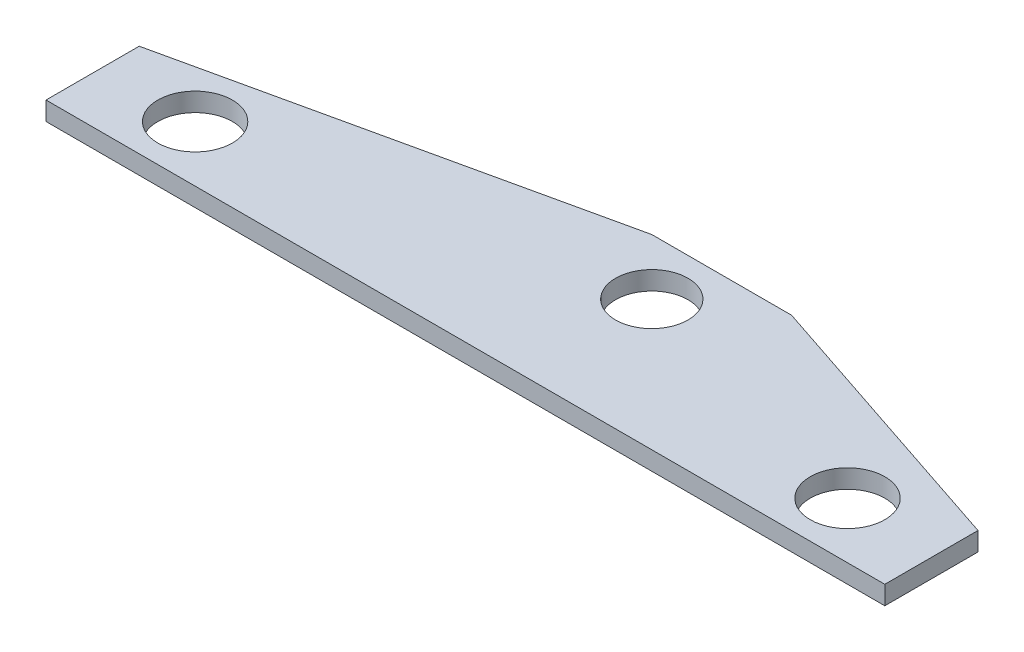
ISO-10303-21;
HEADER;
FILE_DESCRIPTION(('STEP AP214'),'2;1');
FILE_NAME('part.step','',(''),(''),'','','');
FILE_SCHEMA(('AUTOMOTIVE_DESIGN { 1 0 10303 214 1 1 1 1 }'));
ENDSEC;
DATA;
#1=APPLICATION_CONTEXT('core data for automotive mechanical design processes');
#2=APPLICATION_PROTOCOL_DEFINITION('international standard','automotive_design',2000,#1);
#3=PRODUCT_CONTEXT('',#1,'mechanical');
#4=PRODUCT('Part','Part','',(#3));
#5=PRODUCT_RELATED_PRODUCT_CATEGORY('part','',(#4));
#6=PRODUCT_DEFINITION_FORMATION('','',#4);
#7=PRODUCT_DEFINITION_CONTEXT('part definition',#1,'design');
#8=PRODUCT_DEFINITION('design','',#6,#7);
#9=PRODUCT_DEFINITION_SHAPE('','',#8);
#10=(LENGTH_UNIT() NAMED_UNIT(*) SI_UNIT(.MILLI.,.METRE.));
#11=(NAMED_UNIT(*) PLANE_ANGLE_UNIT() SI_UNIT($,.RADIAN.));
#12=(NAMED_UNIT(*) SI_UNIT($,.STERADIAN.) SOLID_ANGLE_UNIT());
#13=UNCERTAINTY_MEASURE_WITH_UNIT(LENGTH_MEASURE(1.E-05),#10,'distance_accuracy_value','');
#14=(GEOMETRIC_REPRESENTATION_CONTEXT(3) GLOBAL_UNCERTAINTY_ASSIGNED_CONTEXT((#13)) GLOBAL_UNIT_ASSIGNED_CONTEXT((#10,
#11,#12)) REPRESENTATION_CONTEXT('',''));
#15=CARTESIAN_POINT('',(0.,0.,0.));
#16=DIRECTION('',(0.,0.,1.));
#17=DIRECTION('',(1.,0.,0.));
#18=AXIS2_PLACEMENT_3D('',#15,#16,#17);
#19=CARTESIAN_POINT('',(0.,2.,0.));
#20=DIRECTION('',(0.,-1.,0.));
#21=DIRECTION('',(0.,0.,-1.));
#22=AXIS2_PLACEMENT_3D('',#19,#20,#21);
#23=PLANE('',#22);
#24=CARTESIAN_POINT('',(51.,2.,-14.));
#25=DIRECTION('',(0.,1.,0.));
#26=DIRECTION('',(0.,0.,1.));
#27=AXIS2_PLACEMENT_3D('',#24,#25,#26);
#28=CIRCLE('',#27,3.88317438694511);
#29=CARTESIAN_POINT('',(51.,2.,-10.1168256130549));
#30=VERTEX_POINT('',#29);
#31=EDGE_CURVE('E176',#30,#30,#28,.T.);
#32=ORIENTED_EDGE('',*,*,#31,.F.);
#33=EDGE_LOOP('',(#32));
#34=FACE_BOUND('',#33,.T.);
#35=CARTESIAN_POINT('',(10.,2.,-6.));
#36=DIRECTION('',(0.,1.,0.));
#37=DIRECTION('',(0.,0.,1.));
#38=AXIS2_PLACEMENT_3D('',#35,#36,#37);
#39=CIRCLE('',#38,4.);
#40=CARTESIAN_POINT('',(10.,2.,-2.));
#41=VERTEX_POINT('',#40);
#42=EDGE_CURVE('E134',#41,#41,#39,.T.);
#43=ORIENTED_EDGE('',*,*,#42,.F.);
#44=EDGE_LOOP('',(#43));
#45=FACE_BOUND('',#44,.T.);
#46=DIRECTION('',(-1.,0.,0.));
#47=VECTOR('',#46,1.);
#48=CARTESIAN_POINT('',(0.,2.,-20.));
#49=LINE('',#48,#47);
#50=CARTESIAN_POINT('',(60.,2.,-20.));
#51=VERTEX_POINT('',#50);
#52=CARTESIAN_POINT('',(45.,2.,-20.));
#53=VERTEX_POINT('',#52);
#54=EDGE_CURVE('E137',#51,#53,#49,.T.);
#55=ORIENTED_EDGE('',*,*,#54,.T.);
#56=DIRECTION('',(0.976187060183953,0.,-0.216930457818656));
#57=VECTOR('',#56,1.);
#58=CARTESIAN_POINT('',(-2.11764705882353,2.,-9.52941176470588));
#59=LINE('',#58,#57);
#60=CARTESIAN_POINT('',(0.,2.,-10.));
#61=VERTEX_POINT('',#60);
#62=EDGE_CURVE('E112',#61,#53,#59,.T.);
#63=ORIENTED_EDGE('',*,*,#62,.F.);
#64=DIRECTION('',(0.,0.,1.));
#65=VECTOR('',#64,1.);
#66=CARTESIAN_POINT('',(0.,2.,0.));
#67=LINE('',#66,#65);
#68=CARTESIAN_POINT('',(0.,2.,0.));
#69=VERTEX_POINT('',#68);
#70=EDGE_CURVE('E119',#61,#69,#67,.T.);
#71=ORIENTED_EDGE('',*,*,#70,.T.);
#72=DIRECTION('',(1.,0.,0.));
#73=VECTOR('',#72,1.);
#74=CARTESIAN_POINT('',(0.,2.,0.));
#75=LINE('',#74,#73);
#76=CARTESIAN_POINT('',(90.,2.,0.));
#77=VERTEX_POINT('',#76);
#78=EDGE_CURVE('E158',#69,#77,#75,.T.);
#79=ORIENTED_EDGE('',*,*,#78,.T.);
#80=DIRECTION('',(0.,0.,-1.));
#81=VECTOR('',#80,1.);
#82=CARTESIAN_POINT('',(90.,2.,0.));
#83=LINE('',#82,#81);
#84=CARTESIAN_POINT('',(90.,2.,-10.));
#85=VERTEX_POINT('',#84);
#86=EDGE_CURVE('E152',#77,#85,#83,.T.);
#87=ORIENTED_EDGE('',*,*,#86,.T.);
#88=DIRECTION('',(0.948683298050514,0.,0.316227766016838));
#89=VECTOR('',#88,1.);
#90=CARTESIAN_POINT('',(12.,2.,-36.));
#91=LINE('',#90,#89);
#92=EDGE_CURVE('E189',#51,#85,#91,.T.);
#93=ORIENTED_EDGE('',*,*,#92,.F.);
#94=EDGE_LOOP('',(#55,#63,#71,#79,#87,#93));
#95=FACE_BOUND('',#94,.T.);
#96=CARTESIAN_POINT('',(80.,2.,-6.00000000000001));
#97=DIRECTION('',(0.,1.,0.));
#98=DIRECTION('',(0.,0.,1.));
#99=AXIS2_PLACEMENT_3D('',#96,#97,#98);
#100=CIRCLE('',#99,4.00000000000001);
#101=CARTESIAN_POINT('',(80.,2.,-2.));
#102=VERTEX_POINT('',#101);
#103=EDGE_CURVE('E168',#102,#102,#100,.F.);
#104=ORIENTED_EDGE('',*,*,#103,.T.);
#105=EDGE_LOOP('',(#104));
#106=FACE_BOUND('',#105,.T.);
#107=ADVANCED_FACE('F51',(#34,#45,#95,#106),#23,.F.);
#108=CARTESIAN_POINT('',(0.,0.,0.));
#109=DIRECTION('',(0.,-1.,0.));
#110=DIRECTION('',(0.,0.,-1.));
#111=AXIS2_PLACEMENT_3D('',#108,#109,#110);
#112=PLANE('',#111);
#113=CARTESIAN_POINT('',(51.,0.,-14.));
#114=DIRECTION('',(0.,1.,0.));
#115=DIRECTION('',(0.,0.,1.));
#116=AXIS2_PLACEMENT_3D('',#113,#114,#115);
#117=CIRCLE('',#116,3.88317438694511);
#118=CARTESIAN_POINT('',(51.,0.,-10.1168256130549));
#119=VERTEX_POINT('',#118);
#120=EDGE_CURVE('E166',#119,#119,#117,.T.);
#121=ORIENTED_EDGE('',*,*,#120,.T.);
#122=EDGE_LOOP('',(#121));
#123=FACE_BOUND('',#122,.T.);
#124=CARTESIAN_POINT('',(10.,0.,-6.));
#125=DIRECTION('',(0.,1.,0.));
#126=DIRECTION('',(0.,0.,1.));
#127=AXIS2_PLACEMENT_3D('',#124,#125,#126);
#128=CIRCLE('',#127,4.);
#129=CARTESIAN_POINT('',(10.,0.,-2.));
#130=VERTEX_POINT('',#129);
#131=EDGE_CURVE('E127',#130,#130,#128,.T.);
#132=ORIENTED_EDGE('',*,*,#131,.T.);
#133=EDGE_LOOP('',(#132));
#134=FACE_BOUND('',#133,.T.);
#135=DIRECTION('',(0.976187060183953,0.,-0.216930457818656));
#136=VECTOR('',#135,1.);
#137=CARTESIAN_POINT('',(-2.11764705882353,0.,-9.52941176470588));
#138=LINE('',#137,#136);
#139=CARTESIAN_POINT('',(0.,0.,-10.));
#140=VERTEX_POINT('',#139);
#141=CARTESIAN_POINT('',(45.,0.,-20.));
#142=VERTEX_POINT('',#141);
#143=EDGE_CURVE('E102',#140,#142,#138,.T.);
#144=ORIENTED_EDGE('',*,*,#143,.T.);
#145=DIRECTION('',(-1.,0.,0.));
#146=VECTOR('',#145,1.);
#147=CARTESIAN_POINT('',(0.,0.,-20.));
#148=LINE('',#147,#146);
#149=CARTESIAN_POINT('',(60.,0.,-20.));
#150=VERTEX_POINT('',#149);
#151=EDGE_CURVE('E143',#150,#142,#148,.T.);
#152=ORIENTED_EDGE('',*,*,#151,.F.);
#153=DIRECTION('',(0.948683298050514,0.,0.316227766016838));
#154=VECTOR('',#153,1.);
#155=CARTESIAN_POINT('',(12.,0.,-36.));
#156=LINE('',#155,#154);
#157=CARTESIAN_POINT('',(90.,0.,-10.));
#158=VERTEX_POINT('',#157);
#159=EDGE_CURVE('E186',#150,#158,#156,.T.);
#160=ORIENTED_EDGE('',*,*,#159,.T.);
#161=DIRECTION('',(0.,0.,-1.));
#162=VECTOR('',#161,1.);
#163=CARTESIAN_POINT('',(90.,0.,0.));
#164=LINE('',#163,#162);
#165=CARTESIAN_POINT('',(90.,0.,0.));
#166=VERTEX_POINT('',#165);
#167=EDGE_CURVE('E131',#166,#158,#164,.T.);
#168=ORIENTED_EDGE('',*,*,#167,.F.);
#169=DIRECTION('',(1.,0.,0.));
#170=VECTOR('',#169,1.);
#171=CARTESIAN_POINT('',(0.,0.,0.));
#172=LINE('',#171,#170);
#173=CARTESIAN_POINT('',(0.,0.,0.));
#174=VERTEX_POINT('',#173);
#175=EDGE_CURVE('E125',#174,#166,#172,.T.);
#176=ORIENTED_EDGE('',*,*,#175,.F.);
#177=DIRECTION('',(0.,0.,1.));
#178=VECTOR('',#177,1.);
#179=CARTESIAN_POINT('',(0.,0.,0.));
#180=LINE('',#179,#178);
#181=EDGE_CURVE('E117',#140,#174,#180,.T.);
#182=ORIENTED_EDGE('',*,*,#181,.F.);
#183=EDGE_LOOP('',(#144,#152,#160,#168,#176,#182));
#184=FACE_BOUND('',#183,.T.);
#185=CARTESIAN_POINT('',(80.,0.,-6.00000000000001));
#186=DIRECTION('',(0.,1.,0.));
#187=DIRECTION('',(0.,0.,1.));
#188=AXIS2_PLACEMENT_3D('',#185,#186,#187);
#189=CIRCLE('',#188,4.00000000000001);
#190=CARTESIAN_POINT('',(80.,0.,-2.));
#191=VERTEX_POINT('',#190);
#192=EDGE_CURVE('E172',#191,#191,#189,.F.);
#193=ORIENTED_EDGE('',*,*,#192,.F.);
#194=EDGE_LOOP('',(#193));
#195=FACE_BOUND('',#194,.T.);
#196=ADVANCED_FACE('F122',(#123,#134,#184,#195),#112,.T.);
#197=CARTESIAN_POINT('',(0.,2.,0.));
#198=DIRECTION('',(1.,0.,0.));
#199=DIRECTION('',(0.,0.,-1.));
#200=AXIS2_PLACEMENT_3D('',#197,#198,#199);
#201=PLANE('',#200);
#202=ORIENTED_EDGE('',*,*,#70,.F.);
#203=DIRECTION('',(0.,1.,0.));
#204=VECTOR('',#203,1.);
#205=CARTESIAN_POINT('',(0.,0.,-10.));
#206=LINE('',#205,#204);
#207=EDGE_CURVE('E105',#140,#61,#206,.T.);
#208=ORIENTED_EDGE('',*,*,#207,.F.);
#209=ORIENTED_EDGE('',*,*,#181,.T.);
#210=DIRECTION('',(0.,-1.,0.));
#211=VECTOR('',#210,1.);
#212=CARTESIAN_POINT('',(0.,2.,0.));
#213=LINE('',#212,#211);
#214=EDGE_CURVE('E12',#69,#174,#213,.T.);
#215=ORIENTED_EDGE('',*,*,#214,.F.);
#216=EDGE_LOOP('',(#202,#208,#209,#215));
#217=FACE_BOUND('',#216,.T.);
#218=ADVANCED_FACE('F53',(#217),#201,.F.);
#219=CARTESIAN_POINT('',(0.,2.,0.));
#220=DIRECTION('',(0.,0.,-1.));
#221=DIRECTION('',(-1.,0.,0.));
#222=AXIS2_PLACEMENT_3D('',#219,#220,#221);
#223=PLANE('',#222);
#224=ORIENTED_EDGE('',*,*,#175,.T.);
#225=DIRECTION('',(0.,-1.,0.));
#226=VECTOR('',#225,1.);
#227=CARTESIAN_POINT('',(90.,2.,0.));
#228=LINE('',#227,#226);
#229=EDGE_CURVE('E60',#77,#166,#228,.T.);
#230=ORIENTED_EDGE('',*,*,#229,.F.);
#231=ORIENTED_EDGE('',*,*,#78,.F.);
#232=ORIENTED_EDGE('',*,*,#214,.T.);
#233=EDGE_LOOP('',(#224,#230,#231,#232));
#234=FACE_BOUND('',#233,.T.);
#235=ADVANCED_FACE('F202',(#234),#223,.F.);
#236=CARTESIAN_POINT('',(90.,2.,0.));
#237=DIRECTION('',(-1.,0.,0.));
#238=DIRECTION('',(0.,0.,1.));
#239=AXIS2_PLACEMENT_3D('',#236,#237,#238);
#240=PLANE('',#239);
#241=ORIENTED_EDGE('',*,*,#167,.T.);
#242=DIRECTION('',(0.,1.,0.));
#243=VECTOR('',#242,1.);
#244=CARTESIAN_POINT('',(90.,0.,-10.));
#245=LINE('',#244,#243);
#246=EDGE_CURVE('E67',#158,#85,#245,.T.);
#247=ORIENTED_EDGE('',*,*,#246,.T.);
#248=ORIENTED_EDGE('',*,*,#86,.F.);
#249=ORIENTED_EDGE('',*,*,#229,.T.);
#250=EDGE_LOOP('',(#241,#247,#248,#249));
#251=FACE_BOUND('',#250,.T.);
#252=ADVANCED_FACE('F200',(#251),#240,.F.);
#253=CARTESIAN_POINT('',(0.,2.,-20.));
#254=DIRECTION('',(0.,0.,1.));
#255=DIRECTION('',(1.,0.,0.));
#256=AXIS2_PLACEMENT_3D('',#253,#254,#255);
#257=PLANE('',#256);
#258=ORIENTED_EDGE('',*,*,#151,.T.);
#259=DIRECTION('',(0.,1.,0.));
#260=VECTOR('',#259,1.);
#261=CARTESIAN_POINT('',(45.,0.,-20.));
#262=LINE('',#261,#260);
#263=EDGE_CURVE('E75',#142,#53,#262,.T.);
#264=ORIENTED_EDGE('',*,*,#263,.T.);
#265=ORIENTED_EDGE('',*,*,#54,.F.);
#266=DIRECTION('',(0.,1.,0.));
#267=VECTOR('',#266,1.);
#268=CARTESIAN_POINT('',(60.,0.,-20.));
#269=LINE('',#268,#267);
#270=EDGE_CURVE('E183',#150,#51,#269,.T.);
#271=ORIENTED_EDGE('',*,*,#270,.F.);
#272=EDGE_LOOP('',(#258,#264,#265,#271));
#273=FACE_BOUND('',#272,.T.);
#274=ADVANCED_FACE('F198',(#273),#257,.F.);
#275=CARTESIAN_POINT('',(10.,0.,-6.));
#276=DIRECTION('',(0.,1.,0.));
#277=DIRECTION('',(0.,0.,1.));
#278=AXIS2_PLACEMENT_3D('',#275,#276,#277);
#279=CYLINDRICAL_SURFACE('',#278,4.);
#280=ORIENTED_EDGE('',*,*,#131,.F.);
#281=EDGE_LOOP('',(#280));
#282=FACE_BOUND('',#281,.T.);
#283=ORIENTED_EDGE('',*,*,#42,.T.);
#284=EDGE_LOOP('',(#283));
#285=FACE_BOUND('',#284,.T.);
#286=ADVANCED_FACE('F208',(#282,#285),#279,.F.);
#287=CARTESIAN_POINT('',(12.,0.,-36.));
#288=DIRECTION('',(-0.316227766016838,0.,0.948683298050514));
#289=DIRECTION('',(0.948683298050514,0.,0.316227766016838));
#290=AXIS2_PLACEMENT_3D('',#287,#288,#289);
#291=PLANE('',#290);
#292=ORIENTED_EDGE('',*,*,#92,.T.);
#293=ORIENTED_EDGE('',*,*,#246,.F.);
#294=ORIENTED_EDGE('',*,*,#159,.F.);
#295=ORIENTED_EDGE('',*,*,#270,.T.);
#296=EDGE_LOOP('',(#292,#293,#294,#295));
#297=FACE_BOUND('',#296,.T.);
#298=ADVANCED_FACE('F224',(#297),#291,.F.);
#299=CARTESIAN_POINT('',(-2.11764705882353,0.,-9.52941176470588));
#300=DIRECTION('',(0.216930457818656,0.,0.976187060183953));
#301=DIRECTION('',(0.976187060183953,0.,-0.216930457818656));
#302=AXIS2_PLACEMENT_3D('',#299,#300,#301);
#303=PLANE('',#302);
#304=ORIENTED_EDGE('',*,*,#62,.T.);
#305=ORIENTED_EDGE('',*,*,#263,.F.);
#306=ORIENTED_EDGE('',*,*,#143,.F.);
#307=ORIENTED_EDGE('',*,*,#207,.T.);
#308=EDGE_LOOP('',(#304,#305,#306,#307));
#309=FACE_BOUND('',#308,.T.);
#310=ADVANCED_FACE('F104',(#309),#303,.F.);
#311=CARTESIAN_POINT('',(80.,0.,-6.00000000000001));
#312=DIRECTION('',(0.,1.,0.));
#313=DIRECTION('',(0.,0.,1.));
#314=AXIS2_PLACEMENT_3D('',#311,#312,#313);
#315=CYLINDRICAL_SURFACE('',#314,4.00000000000001);
#316=ORIENTED_EDGE('',*,*,#192,.T.);
#317=EDGE_LOOP('',(#316));
#318=FACE_BOUND('',#317,.T.);
#319=ORIENTED_EDGE('',*,*,#103,.F.);
#320=EDGE_LOOP('',(#319));
#321=FACE_BOUND('',#320,.T.);
#322=ADVANCED_FACE('F226',(#318,#321),#315,.F.);
#323=CARTESIAN_POINT('',(51.,0.,-14.));
#324=DIRECTION('',(0.,1.,0.));
#325=DIRECTION('',(0.,0.,1.));
#326=AXIS2_PLACEMENT_3D('',#323,#324,#325);
#327=CYLINDRICAL_SURFACE('',#326,3.88317438694511);
#328=ORIENTED_EDGE('',*,*,#120,.F.);
#329=EDGE_LOOP('',(#328));
#330=FACE_BOUND('',#329,.T.);
#331=ORIENTED_EDGE('',*,*,#31,.T.);
#332=EDGE_LOOP('',(#331));
#333=FACE_BOUND('',#332,.T.);
#334=ADVANCED_FACE('F229',(#330,#333),#327,.F.);
#335=CLOSED_SHELL('',(#107,#196,#218,#235,#252,#274,#286,#298,#310,#322,#334));
#336=MANIFOLD_SOLID_BREP('B2',#335);
#337=ADVANCED_BREP_SHAPE_REPRESENTATION('',(#18,#336),#14);
#338=SHAPE_DEFINITION_REPRESENTATION(#9,#337);
ENDSEC;
END-ISO-10303-21;
